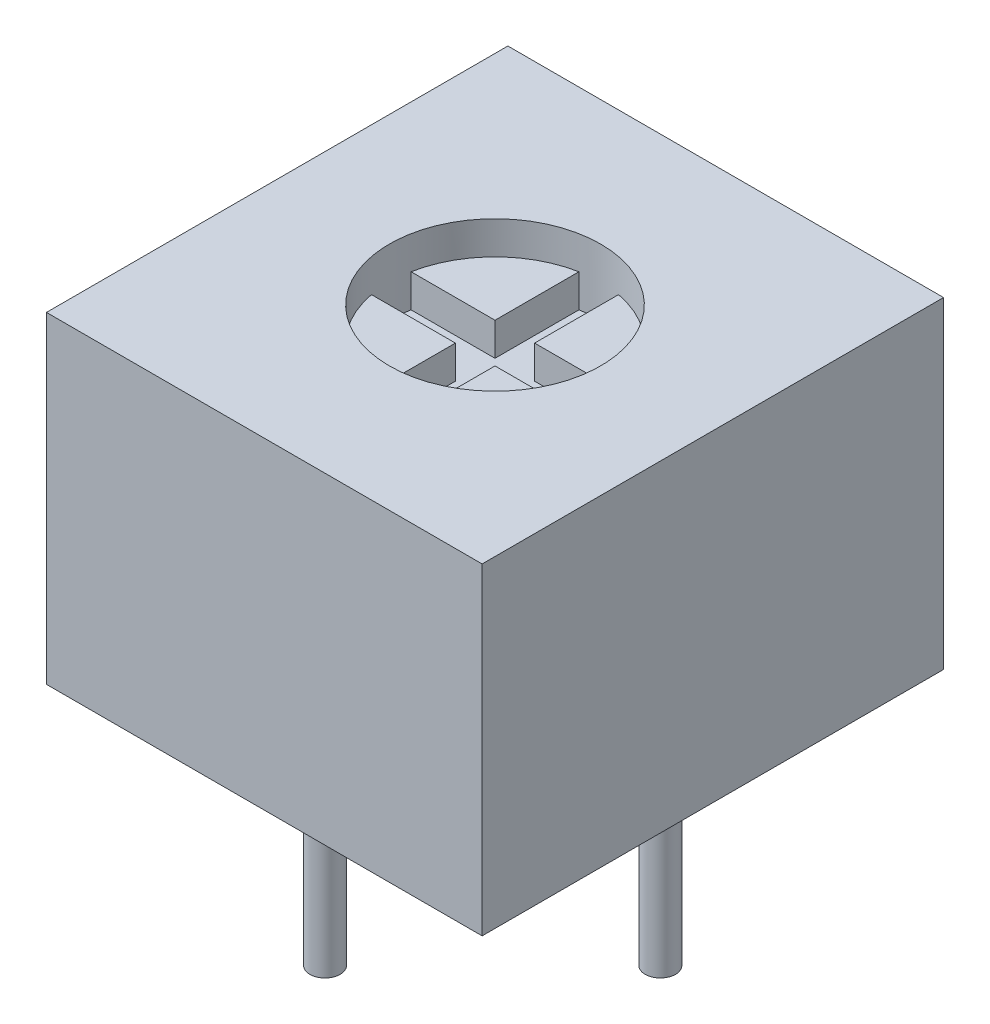
ISO-10303-21;
HEADER;
FILE_DESCRIPTION(('STEP AP214'),'2;1');
FILE_NAME('part.step','',(''),(''),'','','');
FILE_SCHEMA(('AUTOMOTIVE_DESIGN { 1 0 10303 214 1 1 1 1 }'));
ENDSEC;
DATA;
#1=APPLICATION_CONTEXT('core data for automotive mechanical design processes');
#2=APPLICATION_PROTOCOL_DEFINITION('international standard','automotive_design',2000,#1);
#3=PRODUCT_CONTEXT('',#1,'mechanical');
#4=PRODUCT('Part','Part','',(#3));
#5=PRODUCT_RELATED_PRODUCT_CATEGORY('part','',(#4));
#6=PRODUCT_DEFINITION_FORMATION('','',#4);
#7=PRODUCT_DEFINITION_CONTEXT('part definition',#1,'design');
#8=PRODUCT_DEFINITION('design','',#6,#7);
#9=PRODUCT_DEFINITION_SHAPE('','',#8);
#10=(LENGTH_UNIT() NAMED_UNIT(*) SI_UNIT(.MILLI.,.METRE.));
#11=(NAMED_UNIT(*) PLANE_ANGLE_UNIT() SI_UNIT($,.RADIAN.));
#12=(NAMED_UNIT(*) SI_UNIT($,.STERADIAN.) SOLID_ANGLE_UNIT());
#13=UNCERTAINTY_MEASURE_WITH_UNIT(LENGTH_MEASURE(1.E-05),#10,'distance_accuracy_value','');
#14=(GEOMETRIC_REPRESENTATION_CONTEXT(3) GLOBAL_UNCERTAINTY_ASSIGNED_CONTEXT((#13)) GLOBAL_UNIT_ASSIGNED_CONTEXT((#10,
#11,#12)) REPRESENTATION_CONTEXT('',''));
#15=CARTESIAN_POINT('',(0.,0.,0.));
#16=DIRECTION('',(0.,0.,1.));
#17=DIRECTION('',(1.,0.,0.));
#18=AXIS2_PLACEMENT_3D('',#15,#16,#17);
#19=CARTESIAN_POINT('',(-0.3,3.88,0.));
#20=DIRECTION('',(-1.,0.,0.));
#21=DIRECTION('',(0.,0.,1.));
#22=AXIS2_PLACEMENT_3D('',#19,#20,#21);
#23=PLANE('',#22);
#24=DIRECTION('',(0.,0.,1.));
#25=VECTOR('',#24,1.);
#26=CARTESIAN_POINT('',(-0.3,4.38,0.));
#27=LINE('',#26,#25);
#28=CARTESIAN_POINT('',(-0.3,4.38,0.299999999999999));
#29=VERTEX_POINT('',#28);
#30=CARTESIAN_POINT('',(-0.300000000000001,4.38,1.57162336455017));
#31=VERTEX_POINT('',#30);
#32=EDGE_CURVE('E162',#29,#31,#27,.T.);
#33=ORIENTED_EDGE('',*,*,#32,.T.);
#34=DIRECTION('',(0.,1.,0.));
#35=VECTOR('',#34,1.);
#36=CARTESIAN_POINT('',(-0.300000000000001,3.88,1.57162336455017));
#37=LINE('',#36,#35);
#38=CARTESIAN_POINT('',(-0.300000000000001,3.88,1.57162336455017));
#39=VERTEX_POINT('',#38);
#40=EDGE_CURVE('E213',#39,#31,#37,.T.);
#41=ORIENTED_EDGE('',*,*,#40,.F.);
#42=DIRECTION('',(0.,0.,1.));
#43=VECTOR('',#42,1.);
#44=CARTESIAN_POINT('',(-0.3,3.88,0.));
#45=LINE('',#44,#43);
#46=CARTESIAN_POINT('',(-0.3,3.88,0.299999999999999));
#47=VERTEX_POINT('',#46);
#48=EDGE_CURVE('E196',#47,#39,#45,.T.);
#49=ORIENTED_EDGE('',*,*,#48,.F.);
#50=DIRECTION('',(0.,1.,0.));
#51=VECTOR('',#50,1.);
#52=CARTESIAN_POINT('',(-0.3,3.88,0.299999999999999));
#53=LINE('',#52,#51);
#54=EDGE_CURVE('E171',#47,#29,#53,.T.);
#55=ORIENTED_EDGE('',*,*,#54,.T.);
#56=EDGE_LOOP('',(#33,#41,#49,#55));
#57=FACE_BOUND('',#56,.T.);
#58=ADVANCED_FACE('F37',(#57),#23,.F.);
#59=CARTESIAN_POINT('',(0.,3.88,0.3));
#60=DIRECTION('',(0.,0.,1.));
#61=DIRECTION('',(1.,0.,0.));
#62=AXIS2_PLACEMENT_3D('',#59,#60,#61);
#63=PLANE('',#62);
#64=DIRECTION('',(1.,0.,0.));
#65=VECTOR('',#64,1.);
#66=CARTESIAN_POINT('',(0.,4.38,0.3));
#67=LINE('',#66,#65);
#68=CARTESIAN_POINT('',(-1.57162336455017,4.38,0.299999999999999));
#69=VERTEX_POINT('',#68);
#70=EDGE_CURVE('E315',#69,#29,#67,.T.);
#71=ORIENTED_EDGE('',*,*,#70,.T.);
#72=ORIENTED_EDGE('',*,*,#54,.F.);
#73=DIRECTION('',(1.,0.,0.));
#74=VECTOR('',#73,1.);
#75=CARTESIAN_POINT('',(0.,3.88,0.3));
#76=LINE('',#75,#74);
#77=CARTESIAN_POINT('',(-1.57162336455017,3.88,0.299999999999999));
#78=VERTEX_POINT('',#77);
#79=EDGE_CURVE('E330',#78,#47,#76,.T.);
#80=ORIENTED_EDGE('',*,*,#79,.F.);
#81=DIRECTION('',(0.,1.,0.));
#82=VECTOR('',#81,1.);
#83=CARTESIAN_POINT('',(-1.57162336455017,3.88,0.299999999999999));
#84=LINE('',#83,#82);
#85=EDGE_CURVE('E168',#78,#69,#84,.T.);
#86=ORIENTED_EDGE('',*,*,#85,.T.);
#87=EDGE_LOOP('',(#71,#72,#80,#86));
#88=FACE_BOUND('',#87,.T.);
#89=ADVANCED_FACE('F271',(#88),#63,.F.);
#90=CARTESIAN_POINT('',(0.,3.88,-0.3));
#91=DIRECTION('',(0.,0.,1.));
#92=DIRECTION('',(1.,0.,0.));
#93=AXIS2_PLACEMENT_3D('',#90,#91,#92);
#94=PLANE('',#93);
#95=DIRECTION('',(0.,1.,0.));
#96=VECTOR('',#95,1.);
#97=CARTESIAN_POINT('',(-0.3,3.88,-0.3));
#98=LINE('',#97,#96);
#99=CARTESIAN_POINT('',(-0.3,3.88,-0.3));
#100=VERTEX_POINT('',#99);
#101=CARTESIAN_POINT('',(-0.3,4.38,-0.3));
#102=VERTEX_POINT('',#101);
#103=EDGE_CURVE('E161',#100,#102,#98,.T.);
#104=ORIENTED_EDGE('',*,*,#103,.T.);
#105=DIRECTION('',(1.,0.,0.));
#106=VECTOR('',#105,1.);
#107=CARTESIAN_POINT('',(0.,4.38,-0.3));
#108=LINE('',#107,#106);
#109=CARTESIAN_POINT('',(-1.57162336455017,4.38,-0.3));
#110=VERTEX_POINT('',#109);
#111=EDGE_CURVE('E150',#110,#102,#108,.T.);
#112=ORIENTED_EDGE('',*,*,#111,.F.);
#113=DIRECTION('',(0.,1.,0.));
#114=VECTOR('',#113,1.);
#115=CARTESIAN_POINT('',(-1.57162336455017,3.88,-0.300000000000001));
#116=LINE('',#115,#114);
#117=CARTESIAN_POINT('',(-1.57162336455017,3.88,-0.300000000000001));
#118=VERTEX_POINT('',#117);
#119=EDGE_CURVE('E158',#118,#110,#116,.T.);
#120=ORIENTED_EDGE('',*,*,#119,.F.);
#121=DIRECTION('',(1.,0.,0.));
#122=VECTOR('',#121,1.);
#123=CARTESIAN_POINT('',(0.,3.88,-0.3));
#124=LINE('',#123,#122);
#125=EDGE_CURVE('E331',#118,#100,#124,.T.);
#126=ORIENTED_EDGE('',*,*,#125,.T.);
#127=EDGE_LOOP('',(#104,#112,#120,#126));
#128=FACE_BOUND('',#127,.T.);
#129=ADVANCED_FACE('F157',(#128),#94,.T.);
#130=CARTESIAN_POINT('',(-0.3,3.88,0.));
#131=DIRECTION('',(1.,0.,0.));
#132=DIRECTION('',(0.,0.,-1.));
#133=AXIS2_PLACEMENT_3D('',#130,#131,#132);
#134=PLANE('',#133);
#135=DIRECTION('',(0.,1.,0.));
#136=VECTOR('',#135,1.);
#137=CARTESIAN_POINT('',(-0.3,3.88,-1.57162336455017));
#138=LINE('',#137,#136);
#139=CARTESIAN_POINT('',(-0.3,3.88,-1.57162336455017));
#140=VERTEX_POINT('',#139);
#141=CARTESIAN_POINT('',(-0.3,4.38,-1.57162336455017));
#142=VERTEX_POINT('',#141);
#143=EDGE_CURVE('E173',#140,#142,#138,.T.);
#144=ORIENTED_EDGE('',*,*,#143,.T.);
#145=DIRECTION('',(0.,0.,-1.));
#146=VECTOR('',#145,1.);
#147=CARTESIAN_POINT('',(-0.3,4.38,0.));
#148=LINE('',#147,#146);
#149=EDGE_CURVE('E60',#102,#142,#148,.T.);
#150=ORIENTED_EDGE('',*,*,#149,.F.);
#151=ORIENTED_EDGE('',*,*,#103,.F.);
#152=DIRECTION('',(0.,0.,-1.));
#153=VECTOR('',#152,1.);
#154=CARTESIAN_POINT('',(-0.3,3.88,0.));
#155=LINE('',#154,#153);
#156=EDGE_CURVE('E335',#100,#140,#155,.T.);
#157=ORIENTED_EDGE('',*,*,#156,.T.);
#158=EDGE_LOOP('',(#144,#150,#151,#157));
#159=FACE_BOUND('',#158,.T.);
#160=ADVANCED_FACE('F286',(#159),#134,.T.);
#161=CARTESIAN_POINT('',(0.299999999999999,3.88,0.));
#162=DIRECTION('',(1.,0.,0.));
#163=DIRECTION('',(0.,0.,-1.));
#164=AXIS2_PLACEMENT_3D('',#161,#162,#163);
#165=PLANE('',#164);
#166=DIRECTION('',(0.,0.,-1.));
#167=VECTOR('',#166,1.);
#168=CARTESIAN_POINT('',(0.299999999999999,4.38,0.));
#169=LINE('',#168,#167);
#170=CARTESIAN_POINT('',(0.299999999999999,4.38,-0.3));
#171=VERTEX_POINT('',#170);
#172=CARTESIAN_POINT('',(0.299999999999999,4.38,-1.57162336455017));
#173=VERTEX_POINT('',#172);
#174=EDGE_CURVE('E356',#171,#173,#169,.T.);
#175=ORIENTED_EDGE('',*,*,#174,.T.);
#176=DIRECTION('',(0.,1.,0.));
#177=VECTOR('',#176,1.);
#178=CARTESIAN_POINT('',(0.299999999999999,3.88,-1.57162336455017));
#179=LINE('',#178,#177);
#180=CARTESIAN_POINT('',(0.299999999999999,3.88,-1.57162336455017));
#181=VERTEX_POINT('',#180);
#182=EDGE_CURVE('E178',#181,#173,#179,.T.);
#183=ORIENTED_EDGE('',*,*,#182,.F.);
#184=DIRECTION('',(0.,0.,-1.));
#185=VECTOR('',#184,1.);
#186=CARTESIAN_POINT('',(0.299999999999999,3.88,0.));
#187=LINE('',#186,#185);
#188=CARTESIAN_POINT('',(0.299999999999999,3.88,-0.3));
#189=VERTEX_POINT('',#188);
#190=EDGE_CURVE('E340',#189,#181,#187,.T.);
#191=ORIENTED_EDGE('',*,*,#190,.F.);
#192=DIRECTION('',(0.,1.,0.));
#193=VECTOR('',#192,1.);
#194=CARTESIAN_POINT('',(0.299999999999999,3.88,-0.3));
#195=LINE('',#194,#193);
#196=EDGE_CURVE('E181',#189,#171,#195,.T.);
#197=ORIENTED_EDGE('',*,*,#196,.T.);
#198=EDGE_LOOP('',(#175,#183,#191,#197));
#199=FACE_BOUND('',#198,.T.);
#200=ADVANCED_FACE('F289',(#199),#165,.F.);
#201=CARTESIAN_POINT('',(0.,3.88,-0.3));
#202=DIRECTION('',(0.,0.,-1.));
#203=DIRECTION('',(-1.,0.,0.));
#204=AXIS2_PLACEMENT_3D('',#201,#202,#203);
#205=PLANE('',#204);
#206=DIRECTION('',(-1.,0.,0.));
#207=VECTOR('',#206,1.);
#208=CARTESIAN_POINT('',(0.,4.38,-0.3));
#209=LINE('',#208,#207);
#210=CARTESIAN_POINT('',(1.57162336455017,4.38,-0.300000000000001));
#211=VERTEX_POINT('',#210);
#212=EDGE_CURVE('E363',#211,#171,#209,.T.);
#213=ORIENTED_EDGE('',*,*,#212,.T.);
#214=ORIENTED_EDGE('',*,*,#196,.F.);
#215=DIRECTION('',(-1.,0.,0.));
#216=VECTOR('',#215,1.);
#217=CARTESIAN_POINT('',(0.,3.88,-0.3));
#218=LINE('',#217,#216);
#219=CARTESIAN_POINT('',(1.57162336455017,3.88,-0.300000000000001));
#220=VERTEX_POINT('',#219);
#221=EDGE_CURVE('E343',#220,#189,#218,.T.);
#222=ORIENTED_EDGE('',*,*,#221,.F.);
#223=DIRECTION('',(0.,1.,0.));
#224=VECTOR('',#223,1.);
#225=CARTESIAN_POINT('',(1.57162336455017,3.88,-0.300000000000001));
#226=LINE('',#225,#224);
#227=EDGE_CURVE('E184',#220,#211,#226,.T.);
#228=ORIENTED_EDGE('',*,*,#227,.T.);
#229=EDGE_LOOP('',(#213,#214,#222,#228));
#230=FACE_BOUND('',#229,.T.);
#231=ADVANCED_FACE('F293',(#230),#205,.F.);
#232=CARTESIAN_POINT('',(0.,3.88,0.299999999999999));
#233=DIRECTION('',(0.,0.,-1.));
#234=DIRECTION('',(-1.,0.,0.));
#235=AXIS2_PLACEMENT_3D('',#232,#233,#234);
#236=PLANE('',#235);
#237=DIRECTION('',(0.,1.,0.));
#238=VECTOR('',#237,1.);
#239=CARTESIAN_POINT('',(0.299999999999999,3.88,0.3));
#240=LINE('',#239,#238);
#241=CARTESIAN_POINT('',(0.299999999999999,3.88,0.3));
#242=VERTEX_POINT('',#241);
#243=CARTESIAN_POINT('',(0.299999999999999,4.38,0.3));
#244=VERTEX_POINT('',#243);
#245=EDGE_CURVE('E190',#242,#244,#240,.T.);
#246=ORIENTED_EDGE('',*,*,#245,.T.);
#247=DIRECTION('',(-1.,0.,0.));
#248=VECTOR('',#247,1.);
#249=CARTESIAN_POINT('',(0.,4.38,0.299999999999999));
#250=LINE('',#249,#248);
#251=CARTESIAN_POINT('',(1.57162336455017,4.38,0.300000000000001));
#252=VERTEX_POINT('',#251);
#253=EDGE_CURVE('E354',#252,#244,#250,.T.);
#254=ORIENTED_EDGE('',*,*,#253,.F.);
#255=DIRECTION('',(0.,1.,0.));
#256=VECTOR('',#255,1.);
#257=CARTESIAN_POINT('',(1.57162336455017,3.88,0.300000000000001));
#258=LINE('',#257,#256);
#259=CARTESIAN_POINT('',(1.57162336455017,3.88,0.300000000000001));
#260=VERTEX_POINT('',#259);
#261=EDGE_CURVE('E187',#260,#252,#258,.T.);
#262=ORIENTED_EDGE('',*,*,#261,.F.);
#263=DIRECTION('',(-1.,0.,0.));
#264=VECTOR('',#263,1.);
#265=CARTESIAN_POINT('',(0.,3.88,0.299999999999999));
#266=LINE('',#265,#264);
#267=EDGE_CURVE('E349',#260,#242,#266,.T.);
#268=ORIENTED_EDGE('',*,*,#267,.T.);
#269=EDGE_LOOP('',(#246,#254,#262,#268));
#270=FACE_BOUND('',#269,.T.);
#271=ADVANCED_FACE('F297',(#270),#236,.T.);
#272=CARTESIAN_POINT('',(0.299999999999999,3.88,0.));
#273=DIRECTION('',(-1.,0.,0.));
#274=DIRECTION('',(0.,0.,1.));
#275=AXIS2_PLACEMENT_3D('',#272,#273,#274);
#276=PLANE('',#275);
#277=DIRECTION('',(0.,1.,0.));
#278=VECTOR('',#277,1.);
#279=CARTESIAN_POINT('',(0.299999999999999,3.88,1.57162336455017));
#280=LINE('',#279,#278);
#281=CARTESIAN_POINT('',(0.299999999999999,3.88,1.57162336455017));
#282=VERTEX_POINT('',#281);
#283=CARTESIAN_POINT('',(0.299999999999999,4.38,1.57162336455017));
#284=VERTEX_POINT('',#283);
#285=EDGE_CURVE('E193',#282,#284,#280,.T.);
#286=ORIENTED_EDGE('',*,*,#285,.T.);
#287=DIRECTION('',(0.,0.,1.));
#288=VECTOR('',#287,1.);
#289=CARTESIAN_POINT('',(0.299999999999999,4.38,0.));
#290=LINE('',#289,#288);
#291=EDGE_CURVE('E359',#244,#284,#290,.T.);
#292=ORIENTED_EDGE('',*,*,#291,.F.);
#293=ORIENTED_EDGE('',*,*,#245,.F.);
#294=DIRECTION('',(0.,0.,1.));
#295=VECTOR('',#294,1.);
#296=CARTESIAN_POINT('',(0.299999999999999,3.88,0.));
#297=LINE('',#296,#295);
#298=EDGE_CURVE('E318',#242,#282,#297,.T.);
#299=ORIENTED_EDGE('',*,*,#298,.T.);
#300=EDGE_LOOP('',(#286,#292,#293,#299));
#301=FACE_BOUND('',#300,.T.);
#302=ADVANCED_FACE('F301',(#301),#276,.T.);
#303=CARTESIAN_POINT('',(-3.3,4.88,0.));
#304=DIRECTION('',(-1.,0.,0.));
#305=DIRECTION('',(0.,0.,1.));
#306=AXIS2_PLACEMENT_3D('',#303,#304,#305);
#307=PLANE('',#306);
#308=DIRECTION('',(0.,0.,-1.));
#309=VECTOR('',#308,1.);
#310=CARTESIAN_POINT('',(-3.3,0.,0.));
#311=LINE('',#310,#309);
#312=CARTESIAN_POINT('',(-3.3,0.,3.495));
#313=VERTEX_POINT('',#312);
#314=CARTESIAN_POINT('',(-3.3,0.,-3.495));
#315=VERTEX_POINT('',#314);
#316=EDGE_CURVE('E209',#313,#315,#311,.T.);
#317=ORIENTED_EDGE('',*,*,#316,.F.);
#318=DIRECTION('',(0.,-1.,0.));
#319=VECTOR('',#318,1.);
#320=CARTESIAN_POINT('',(-3.3,4.88,3.495));
#321=LINE('',#320,#319);
#322=CARTESIAN_POINT('',(-3.3,4.88,3.495));
#323=VERTEX_POINT('',#322);
#324=EDGE_CURVE('E226',#323,#313,#321,.T.);
#325=ORIENTED_EDGE('',*,*,#324,.F.);
#326=DIRECTION('',(0.,0.,-1.));
#327=VECTOR('',#326,1.);
#328=CARTESIAN_POINT('',(-3.3,4.88,0.));
#329=LINE('',#328,#327);
#330=CARTESIAN_POINT('',(-3.3,4.88,-3.495));
#331=VERTEX_POINT('',#330);
#332=EDGE_CURVE('E197',#323,#331,#329,.T.);
#333=ORIENTED_EDGE('',*,*,#332,.T.);
#334=DIRECTION('',(0.,-1.,0.));
#335=VECTOR('',#334,1.);
#336=CARTESIAN_POINT('',(-3.3,4.88,-3.495));
#337=LINE('',#336,#335);
#338=EDGE_CURVE('E208',#331,#315,#337,.T.);
#339=ORIENTED_EDGE('',*,*,#338,.T.);
#340=EDGE_LOOP('',(#317,#325,#333,#339));
#341=FACE_BOUND('',#340,.T.);
#342=ADVANCED_FACE('F39',(#341),#307,.T.);
#343=CARTESIAN_POINT('',(0.,4.88,3.495));
#344=DIRECTION('',(0.,0.,1.));
#345=DIRECTION('',(1.,0.,0.));
#346=AXIS2_PLACEMENT_3D('',#343,#344,#345);
#347=PLANE('',#346);
#348=DIRECTION('',(-1.,0.,0.));
#349=VECTOR('',#348,1.);
#350=CARTESIAN_POINT('',(0.,0.,3.495));
#351=LINE('',#350,#349);
#352=CARTESIAN_POINT('',(3.3,0.,3.495));
#353=VERTEX_POINT('',#352);
#354=EDGE_CURVE('E212',#353,#313,#351,.T.);
#355=ORIENTED_EDGE('',*,*,#354,.F.);
#356=DIRECTION('',(0.,-1.,0.));
#357=VECTOR('',#356,1.);
#358=CARTESIAN_POINT('',(3.3,4.88,3.495));
#359=LINE('',#358,#357);
#360=CARTESIAN_POINT('',(3.3,4.88,3.495));
#361=VERTEX_POINT('',#360);
#362=EDGE_CURVE('E224',#361,#353,#359,.T.);
#363=ORIENTED_EDGE('',*,*,#362,.F.);
#364=DIRECTION('',(-1.,0.,0.));
#365=VECTOR('',#364,1.);
#366=CARTESIAN_POINT('',(0.,4.88,3.495));
#367=LINE('',#366,#365);
#368=EDGE_CURVE('E200',#361,#323,#367,.T.);
#369=ORIENTED_EDGE('',*,*,#368,.T.);
#370=ORIENTED_EDGE('',*,*,#324,.T.);
#371=EDGE_LOOP('',(#355,#363,#369,#370));
#372=FACE_BOUND('',#371,.T.);
#373=ADVANCED_FACE('F259',(#372),#347,.T.);
#374=CARTESIAN_POINT('',(3.3,4.88,0.));
#375=DIRECTION('',(-1.,0.,0.));
#376=DIRECTION('',(0.,0.,1.));
#377=AXIS2_PLACEMENT_3D('',#374,#375,#376);
#378=PLANE('',#377);
#379=DIRECTION('',(0.,0.,-1.));
#380=VECTOR('',#379,1.);
#381=CARTESIAN_POINT('',(3.3,0.,0.));
#382=LINE('',#381,#380);
#383=CARTESIAN_POINT('',(3.3,0.,-3.495));
#384=VERTEX_POINT('',#383);
#385=EDGE_CURVE('E216',#353,#384,#382,.T.);
#386=ORIENTED_EDGE('',*,*,#385,.T.);
#387=DIRECTION('',(0.,-1.,0.));
#388=VECTOR('',#387,1.);
#389=CARTESIAN_POINT('',(3.3,4.88,-3.495));
#390=LINE('',#389,#388);
#391=CARTESIAN_POINT('',(3.3,4.88,-3.495));
#392=VERTEX_POINT('',#391);
#393=EDGE_CURVE('E221',#392,#384,#390,.T.);
#394=ORIENTED_EDGE('',*,*,#393,.F.);
#395=DIRECTION('',(0.,0.,-1.));
#396=VECTOR('',#395,1.);
#397=CARTESIAN_POINT('',(3.3,4.88,0.));
#398=LINE('',#397,#396);
#399=EDGE_CURVE('E204',#361,#392,#398,.T.);
#400=ORIENTED_EDGE('',*,*,#399,.F.);
#401=ORIENTED_EDGE('',*,*,#362,.T.);
#402=EDGE_LOOP('',(#386,#394,#400,#401));
#403=FACE_BOUND('',#402,.T.);
#404=ADVANCED_FACE('F256',(#403),#378,.F.);
#405=CARTESIAN_POINT('',(0.,4.88,-3.495));
#406=DIRECTION('',(0.,0.,1.));
#407=DIRECTION('',(1.,0.,0.));
#408=AXIS2_PLACEMENT_3D('',#405,#406,#407);
#409=PLANE('',#408);
#410=DIRECTION('',(-1.,0.,0.));
#411=VECTOR('',#410,1.);
#412=CARTESIAN_POINT('',(0.,0.,-3.495));
#413=LINE('',#412,#411);
#414=EDGE_CURVE('E201',#384,#315,#413,.T.);
#415=ORIENTED_EDGE('',*,*,#414,.T.);
#416=ORIENTED_EDGE('',*,*,#338,.F.);
#417=DIRECTION('',(-1.,0.,0.));
#418=VECTOR('',#417,1.);
#419=CARTESIAN_POINT('',(0.,4.88,-3.495));
#420=LINE('',#419,#418);
#421=EDGE_CURVE('E206',#392,#331,#420,.T.);
#422=ORIENTED_EDGE('',*,*,#421,.F.);
#423=ORIENTED_EDGE('',*,*,#393,.T.);
#424=EDGE_LOOP('',(#415,#416,#422,#423));
#425=FACE_BOUND('',#424,.T.);
#426=ADVANCED_FACE('F252',(#425),#409,.F.);
#427=CARTESIAN_POINT('',(0.,4.88,0.));
#428=DIRECTION('',(0.,1.,0.));
#429=DIRECTION('',(0.,0.,1.));
#430=AXIS2_PLACEMENT_3D('',#427,#428,#429);
#431=PLANE('',#430);
#432=CARTESIAN_POINT('',(0.,4.88,0.));
#433=DIRECTION('',(0.,1.,0.));
#434=DIRECTION('',(0.,0.,1.));
#435=AXIS2_PLACEMENT_3D('',#432,#433,#434);
#436=CIRCLE('',#435,1.6);
#437=CARTESIAN_POINT('',(0.,4.88,1.6));
#438=VERTEX_POINT('',#437);
#439=EDGE_CURVE('E313',#438,#438,#436,.T.);
#440=ORIENTED_EDGE('',*,*,#439,.F.);
#441=EDGE_LOOP('',(#440));
#442=FACE_BOUND('',#441,.T.);
#443=ORIENTED_EDGE('',*,*,#332,.F.);
#444=ORIENTED_EDGE('',*,*,#368,.F.);
#445=ORIENTED_EDGE('',*,*,#399,.T.);
#446=ORIENTED_EDGE('',*,*,#421,.T.);
#447=EDGE_LOOP('',(#443,#444,#445,#446));
#448=FACE_BOUND('',#447,.T.);
#449=ADVANCED_FACE('F238',(#442,#448),#431,.T.);
#450=CARTESIAN_POINT('',(0.,0.,0.));
#451=DIRECTION('',(0.,1.,0.));
#452=DIRECTION('',(0.,0.,1.));
#453=AXIS2_PLACEMENT_3D('',#450,#451,#452);
#454=PLANE('',#453);
#455=CARTESIAN_POINT('',(-2.54,0.,0.0349999999999986));
#456=DIRECTION('',(0.,1.,0.));
#457=DIRECTION('',(0.,0.,1.));
#458=AXIS2_PLACEMENT_3D('',#455,#456,#457);
#459=CIRCLE('',#458,0.23);
#460=CARTESIAN_POINT('',(-2.54,0.,0.264999999999998));
#461=VERTEX_POINT('',#460);
#462=EDGE_CURVE('E11',#461,#461,#459,.F.);
#463=ORIENTED_EDGE('',*,*,#462,.F.);
#464=EDGE_LOOP('',(#463));
#465=FACE_BOUND('',#464,.T.);
#466=CARTESIAN_POINT('',(2.54,0.,0.0349999999999986));
#467=DIRECTION('',(0.,1.,0.));
#468=DIRECTION('',(0.,0.,1.));
#469=AXIS2_PLACEMENT_3D('',#466,#467,#468);
#470=CIRCLE('',#469,0.23);
#471=CARTESIAN_POINT('',(2.54,0.,0.264999999999999));
#472=VERTEX_POINT('',#471);
#473=EDGE_CURVE('E45',#472,#472,#470,.F.);
#474=ORIENTED_EDGE('',*,*,#473,.F.);
#475=EDGE_LOOP('',(#474));
#476=FACE_BOUND('',#475,.T.);
#477=CARTESIAN_POINT('',(0.,0.,2.575));
#478=DIRECTION('',(0.,1.,0.));
#479=DIRECTION('',(0.,0.,1.));
#480=AXIS2_PLACEMENT_3D('',#477,#478,#479);
#481=CIRCLE('',#480,0.23);
#482=CARTESIAN_POINT('',(0.,0.,2.805));
#483=VERTEX_POINT('',#482);
#484=EDGE_CURVE('E228',#483,#483,#481,.F.);
#485=ORIENTED_EDGE('',*,*,#484,.F.);
#486=EDGE_LOOP('',(#485));
#487=FACE_BOUND('',#486,.T.);
#488=ORIENTED_EDGE('',*,*,#316,.T.);
#489=ORIENTED_EDGE('',*,*,#414,.F.);
#490=ORIENTED_EDGE('',*,*,#385,.F.);
#491=ORIENTED_EDGE('',*,*,#354,.T.);
#492=EDGE_LOOP('',(#488,#489,#490,#491));
#493=FACE_BOUND('',#492,.T.);
#494=ADVANCED_FACE('F235',(#465,#476,#487,#493),#454,.F.);
#495=CARTESIAN_POINT('',(0.,3.88,0.));
#496=DIRECTION('',(0.,1.,0.));
#497=DIRECTION('',(0.,0.,1.));
#498=AXIS2_PLACEMENT_3D('',#495,#496,#497);
#499=CYLINDRICAL_SURFACE('',#498,1.6);
#500=ORIENTED_EDGE('',*,*,#439,.T.);
#501=EDGE_LOOP('',(#500));
#502=FACE_BOUND('',#501,.T.);
#503=ORIENTED_EDGE('',*,*,#40,.T.);
#504=CARTESIAN_POINT('',(0.,4.38,0.));
#505=DIRECTION('',(0.,1.,0.));
#506=DIRECTION('',(0.,0.,1.));
#507=AXIS2_PLACEMENT_3D('',#504,#505,#506);
#508=CIRCLE('',#507,1.6);
#509=EDGE_CURVE('E52',#69,#31,#508,.T.);
#510=ORIENTED_EDGE('',*,*,#509,.F.);
#511=ORIENTED_EDGE('',*,*,#85,.F.);
#512=CARTESIAN_POINT('',(0.,3.88,0.));
#513=DIRECTION('',(0.,1.,0.));
#514=DIRECTION('',(0.,0.,1.));
#515=AXIS2_PLACEMENT_3D('',#512,#513,#514);
#516=CIRCLE('',#515,1.6);
#517=EDGE_CURVE('E167',#118,#78,#516,.T.);
#518=ORIENTED_EDGE('',*,*,#517,.F.);
#519=ORIENTED_EDGE('',*,*,#119,.T.);
#520=CARTESIAN_POINT('',(0.,4.38,0.));
#521=DIRECTION('',(0.,1.,0.));
#522=DIRECTION('',(0.,0.,1.));
#523=AXIS2_PLACEMENT_3D('',#520,#521,#522);
#524=CIRCLE('',#523,1.6);
#525=EDGE_CURVE('E147',#142,#110,#524,.T.);
#526=ORIENTED_EDGE('',*,*,#525,.F.);
#527=ORIENTED_EDGE('',*,*,#143,.F.);
#528=CARTESIAN_POINT('',(0.,3.88,0.));
#529=DIRECTION('',(0.,1.,0.));
#530=DIRECTION('',(0.,0.,1.));
#531=AXIS2_PLACEMENT_3D('',#528,#529,#530);
#532=CIRCLE('',#531,1.6);
#533=EDGE_CURVE('E337',#181,#140,#532,.T.);
#534=ORIENTED_EDGE('',*,*,#533,.F.);
#535=ORIENTED_EDGE('',*,*,#182,.T.);
#536=CARTESIAN_POINT('',(0.,4.38,0.));
#537=DIRECTION('',(0.,1.,0.));
#538=DIRECTION('',(0.,0.,1.));
#539=AXIS2_PLACEMENT_3D('',#536,#537,#538);
#540=CIRCLE('',#539,1.6);
#541=EDGE_CURVE('E366',#211,#173,#540,.T.);
#542=ORIENTED_EDGE('',*,*,#541,.F.);
#543=ORIENTED_EDGE('',*,*,#227,.F.);
#544=CARTESIAN_POINT('',(0.,3.88,0.));
#545=DIRECTION('',(0.,1.,0.));
#546=DIRECTION('',(0.,0.,1.));
#547=AXIS2_PLACEMENT_3D('',#544,#545,#546);
#548=CIRCLE('',#547,1.6);
#549=EDGE_CURVE('E346',#260,#220,#548,.T.);
#550=ORIENTED_EDGE('',*,*,#549,.F.);
#551=ORIENTED_EDGE('',*,*,#261,.T.);
#552=CARTESIAN_POINT('',(0.,4.38,0.));
#553=DIRECTION('',(0.,1.,0.));
#554=DIRECTION('',(0.,0.,1.));
#555=AXIS2_PLACEMENT_3D('',#552,#553,#554);
#556=CIRCLE('',#555,1.6);
#557=EDGE_CURVE('E357',#284,#252,#556,.T.);
#558=ORIENTED_EDGE('',*,*,#557,.F.);
#559=ORIENTED_EDGE('',*,*,#285,.F.);
#560=CARTESIAN_POINT('',(0.,3.88,0.));
#561=DIRECTION('',(0.,1.,0.));
#562=DIRECTION('',(0.,0.,1.));
#563=AXIS2_PLACEMENT_3D('',#560,#561,#562);
#564=CIRCLE('',#563,1.6);
#565=EDGE_CURVE('E314',#39,#282,#564,.T.);
#566=ORIENTED_EDGE('',*,*,#565,.F.);
#567=EDGE_LOOP('',(#503,#510,#511,#518,#519,#526,#527,#534,#535,#542,#543,#550,#551,#558,#559,#566));
#568=FACE_BOUND('',#567,.T.);
#569=ADVANCED_FACE('F165',(#502,#568),#499,.F.);
#570=CARTESIAN_POINT('',(0.,3.88,0.));
#571=DIRECTION('',(0.,1.,0.));
#572=DIRECTION('',(0.,0.,1.));
#573=AXIS2_PLACEMENT_3D('',#570,#571,#572);
#574=PLANE('',#573);
#575=ORIENTED_EDGE('',*,*,#565,.T.);
#576=ORIENTED_EDGE('',*,*,#298,.F.);
#577=ORIENTED_EDGE('',*,*,#267,.F.);
#578=ORIENTED_EDGE('',*,*,#549,.T.);
#579=ORIENTED_EDGE('',*,*,#221,.T.);
#580=ORIENTED_EDGE('',*,*,#190,.T.);
#581=ORIENTED_EDGE('',*,*,#533,.T.);
#582=ORIENTED_EDGE('',*,*,#156,.F.);
#583=ORIENTED_EDGE('',*,*,#125,.F.);
#584=ORIENTED_EDGE('',*,*,#517,.T.);
#585=ORIENTED_EDGE('',*,*,#79,.T.);
#586=ORIENTED_EDGE('',*,*,#48,.T.);
#587=EDGE_LOOP('',(#575,#576,#577,#578,#579,#580,#581,#582,#583,#584,#585,#586));
#588=FACE_BOUND('',#587,.T.);
#589=ADVANCED_FACE('F281',(#588),#574,.T.);
#590=CARTESIAN_POINT('',(0.,4.38,0.));
#591=DIRECTION('',(0.,1.,0.));
#592=DIRECTION('',(0.,0.,1.));
#593=AXIS2_PLACEMENT_3D('',#590,#591,#592);
#594=PLANE('',#593);
#595=ORIENTED_EDGE('',*,*,#291,.T.);
#596=ORIENTED_EDGE('',*,*,#557,.T.);
#597=ORIENTED_EDGE('',*,*,#253,.T.);
#598=EDGE_LOOP('',(#595,#596,#597));
#599=FACE_BOUND('',#598,.T.);
#600=ADVANCED_FACE('F310',(#599),#594,.T.);
#601=CARTESIAN_POINT('',(0.,4.38,0.));
#602=DIRECTION('',(0.,1.,0.));
#603=DIRECTION('',(0.,0.,1.));
#604=AXIS2_PLACEMENT_3D('',#601,#602,#603);
#605=PLANE('',#604);
#606=ORIENTED_EDGE('',*,*,#174,.F.);
#607=ORIENTED_EDGE('',*,*,#212,.F.);
#608=ORIENTED_EDGE('',*,*,#541,.T.);
#609=EDGE_LOOP('',(#606,#607,#608));
#610=FACE_BOUND('',#609,.T.);
#611=ADVANCED_FACE('F410',(#610),#605,.T.);
#612=CARTESIAN_POINT('',(0.,4.38,0.));
#613=DIRECTION('',(0.,1.,0.));
#614=DIRECTION('',(0.,0.,1.));
#615=AXIS2_PLACEMENT_3D('',#612,#613,#614);
#616=PLANE('',#615);
#617=ORIENTED_EDGE('',*,*,#149,.T.);
#618=ORIENTED_EDGE('',*,*,#525,.T.);
#619=ORIENTED_EDGE('',*,*,#111,.T.);
#620=EDGE_LOOP('',(#617,#618,#619));
#621=FACE_BOUND('',#620,.T.);
#622=ADVANCED_FACE('F149',(#621),#616,.T.);
#623=CARTESIAN_POINT('',(0.,4.38,0.));
#624=DIRECTION('',(0.,1.,0.));
#625=DIRECTION('',(0.,0.,1.));
#626=AXIS2_PLACEMENT_3D('',#623,#624,#625);
#627=PLANE('',#626);
#628=ORIENTED_EDGE('',*,*,#32,.F.);
#629=ORIENTED_EDGE('',*,*,#70,.F.);
#630=ORIENTED_EDGE('',*,*,#509,.T.);
#631=EDGE_LOOP('',(#628,#629,#630));
#632=FACE_BOUND('',#631,.T.);
#633=ADVANCED_FACE('F406',(#632),#627,.T.);
#634=CARTESIAN_POINT('',(0.,-2.5,2.575));
#635=DIRECTION('',(0.,1.,0.));
#636=DIRECTION('',(0.,0.,1.));
#637=AXIS2_PLACEMENT_3D('',#634,#635,#636);
#638=CYLINDRICAL_SURFACE('',#637,0.23);
#639=CARTESIAN_POINT('',(0.,-2.5,2.575));
#640=DIRECTION('',(0.,-1.,0.));
#641=DIRECTION('',(0.,0.,-1.));
#642=AXIS2_PLACEMENT_3D('',#639,#640,#641);
#643=CIRCLE('',#642,0.23);
#644=CARTESIAN_POINT('',(0.,-2.5,2.345));
#645=VERTEX_POINT('',#644);
#646=EDGE_CURVE('E362',#645,#645,#643,.T.);
#647=ORIENTED_EDGE('',*,*,#646,.F.);
#648=EDGE_LOOP('',(#647));
#649=FACE_BOUND('',#648,.T.);
#650=ORIENTED_EDGE('',*,*,#484,.T.);
#651=EDGE_LOOP('',(#650));
#652=FACE_BOUND('',#651,.T.);
#653=ADVANCED_FACE('F402',(#649,#652),#638,.T.);
#654=CARTESIAN_POINT('',(0.,-2.5,2.575));
#655=DIRECTION('',(0.,-1.,0.));
#656=DIRECTION('',(0.,0.,-1.));
#657=AXIS2_PLACEMENT_3D('',#654,#655,#656);
#658=PLANE('',#657);
#659=ORIENTED_EDGE('',*,*,#646,.T.);
#660=EDGE_LOOP('',(#659));
#661=FACE_BOUND('',#660,.T.);
#662=ADVANCED_FACE('F398',(#661),#658,.T.);
#663=CARTESIAN_POINT('',(2.54,-2.5,0.0349999999999986));
#664=DIRECTION('',(0.,1.,0.));
#665=DIRECTION('',(0.,0.,1.));
#666=AXIS2_PLACEMENT_3D('',#663,#664,#665);
#667=CYLINDRICAL_SURFACE('',#666,0.23);
#668=CARTESIAN_POINT('',(2.54,-2.5,0.0349999999999986));
#669=DIRECTION('',(0.,-1.,0.));
#670=DIRECTION('',(0.,0.,-1.));
#671=AXIS2_PLACEMENT_3D('',#668,#669,#670);
#672=CIRCLE('',#671,0.23);
#673=CARTESIAN_POINT('',(2.54,-2.5,-0.195000000000002));
#674=VERTEX_POINT('',#673);
#675=EDGE_CURVE('E373',#674,#674,#672,.T.);
#676=ORIENTED_EDGE('',*,*,#675,.F.);
#677=EDGE_LOOP('',(#676));
#678=FACE_BOUND('',#677,.T.);
#679=ORIENTED_EDGE('',*,*,#473,.T.);
#680=EDGE_LOOP('',(#679));
#681=FACE_BOUND('',#680,.T.);
#682=ADVANCED_FACE('F233',(#678,#681),#667,.T.);
#683=CARTESIAN_POINT('',(2.54,-2.5,0.0349999999999986));
#684=DIRECTION('',(0.,-1.,0.));
#685=DIRECTION('',(0.,0.,-1.));
#686=AXIS2_PLACEMENT_3D('',#683,#684,#685);
#687=PLANE('',#686);
#688=ORIENTED_EDGE('',*,*,#675,.T.);
#689=EDGE_LOOP('',(#688));
#690=FACE_BOUND('',#689,.T.);
#691=ADVANCED_FACE('F385',(#690),#687,.T.);
#692=CARTESIAN_POINT('',(-2.54,-2.5,0.0349999999999986));
#693=DIRECTION('',(0.,1.,0.));
#694=DIRECTION('',(0.,0.,1.));
#695=AXIS2_PLACEMENT_3D('',#692,#693,#694);
#696=CYLINDRICAL_SURFACE('',#695,0.23);
#697=CARTESIAN_POINT('',(-2.54,-2.5,0.0349999999999986));
#698=DIRECTION('',(0.,-1.,0.));
#699=DIRECTION('',(0.,0.,-1.));
#700=AXIS2_PLACEMENT_3D('',#697,#698,#699);
#701=CIRCLE('',#700,0.23);
#702=CARTESIAN_POINT('',(-2.54,-2.5,-0.195000000000001));
#703=VERTEX_POINT('',#702);
#704=EDGE_CURVE('E376',#703,#703,#701,.T.);
#705=ORIENTED_EDGE('',*,*,#704,.F.);
#706=EDGE_LOOP('',(#705));
#707=FACE_BOUND('',#706,.T.);
#708=ORIENTED_EDGE('',*,*,#462,.T.);
#709=EDGE_LOOP('',(#708));
#710=FACE_BOUND('',#709,.T.);
#711=ADVANCED_FACE('F382',(#707,#710),#696,.T.);
#712=CARTESIAN_POINT('',(-2.54,-2.5,0.0349999999999986));
#713=DIRECTION('',(0.,-1.,0.));
#714=DIRECTION('',(0.,0.,-1.));
#715=AXIS2_PLACEMENT_3D('',#712,#713,#714);
#716=PLANE('',#715);
#717=ORIENTED_EDGE('',*,*,#704,.T.);
#718=EDGE_LOOP('',(#717));
#719=FACE_BOUND('',#718,.T.);
#720=ADVANCED_FACE('F380',(#719),#716,.T.);
#721=CLOSED_SHELL('',(#58,#89,#129,#160,#200,#231,#271,#302,#342,#373,#404,#426,#449,#494,#569,
#589,#600,#611,#622,#633,#653,#662,#682,#691,#711,#720));
#722=MANIFOLD_SOLID_BREP('B2',#721);
#723=ADVANCED_BREP_SHAPE_REPRESENTATION('',(#18,#722),#14);
#724=SHAPE_DEFINITION_REPRESENTATION(#9,#723);
ENDSEC;
END-ISO-10303-21;
